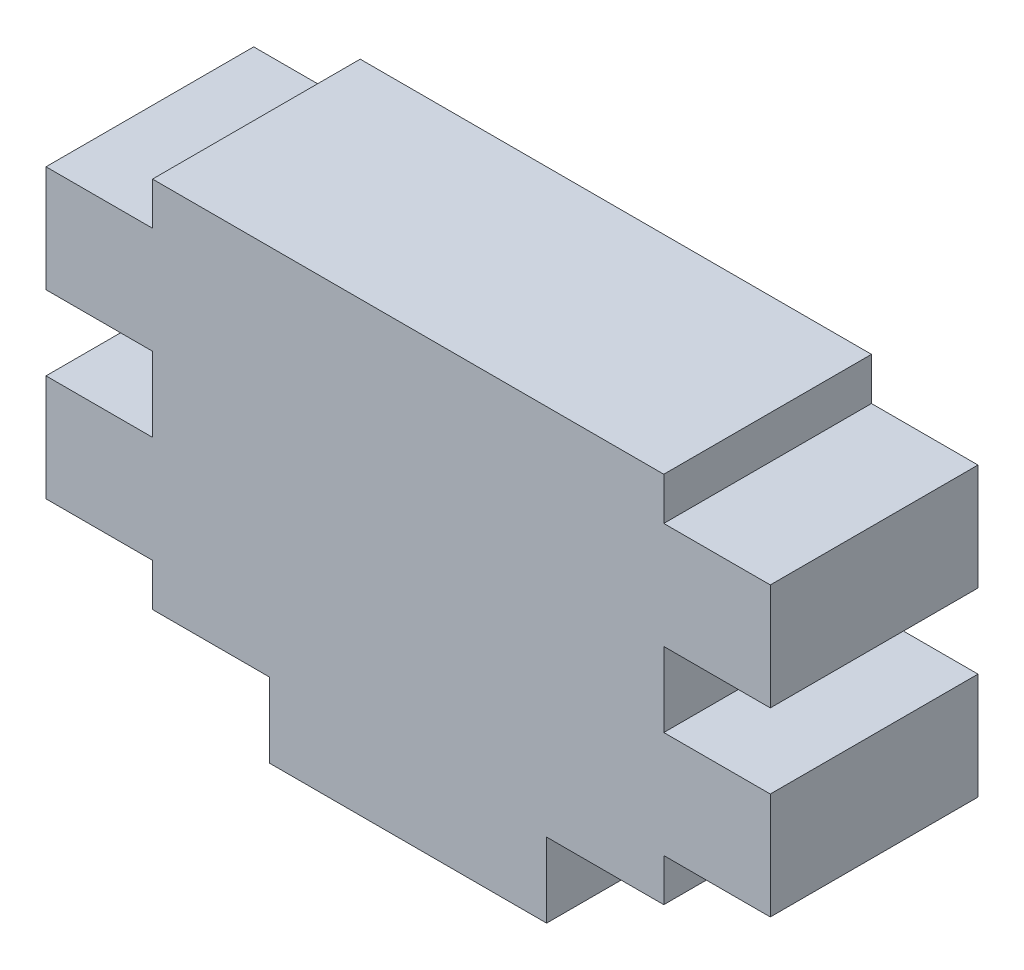
ISO-10303-21;
HEADER;
FILE_DESCRIPTION(('STEP AP214'),'2;1');
FILE_NAME('part.step','',(''),(''),'','','');
FILE_SCHEMA(('AUTOMOTIVE_DESIGN { 1 0 10303 214 1 1 1 1 }'));
ENDSEC;
DATA;
#1=APPLICATION_CONTEXT('core data for automotive mechanical design processes');
#2=APPLICATION_PROTOCOL_DEFINITION('international standard','automotive_design',2000,#1);
#3=PRODUCT_CONTEXT('',#1,'mechanical');
#4=PRODUCT('Part','Part','',(#3));
#5=PRODUCT_RELATED_PRODUCT_CATEGORY('part','',(#4));
#6=PRODUCT_DEFINITION_FORMATION('','',#4);
#7=PRODUCT_DEFINITION_CONTEXT('part definition',#1,'design');
#8=PRODUCT_DEFINITION('design','',#6,#7);
#9=PRODUCT_DEFINITION_SHAPE('','',#8);
#10=(LENGTH_UNIT() NAMED_UNIT(*) SI_UNIT(.MILLI.,.METRE.));
#11=(NAMED_UNIT(*) PLANE_ANGLE_UNIT() SI_UNIT($,.RADIAN.));
#12=(NAMED_UNIT(*) SI_UNIT($,.STERADIAN.) SOLID_ANGLE_UNIT());
#13=UNCERTAINTY_MEASURE_WITH_UNIT(LENGTH_MEASURE(1.E-05),#10,'distance_accuracy_value','');
#14=(GEOMETRIC_REPRESENTATION_CONTEXT(3) GLOBAL_UNCERTAINTY_ASSIGNED_CONTEXT((#13)) GLOBAL_UNIT_ASSIGNED_CONTEXT((#10,
#11,#12)) REPRESENTATION_CONTEXT('',''));
#15=CARTESIAN_POINT('',(0.,0.,0.));
#16=DIRECTION('',(0.,0.,1.));
#17=DIRECTION('',(1.,0.,0.));
#18=AXIS2_PLACEMENT_3D('',#15,#16,#17);
#19=CARTESIAN_POINT('',(3.399966,-0.350022,1.95));
#20=DIRECTION('',(-0.999999998847859,-4.80029281236349E-05,0.));
#21=DIRECTION('',(4.80029281236349E-05,-0.99999999884786,0.));
#22=AXIS2_PLACEMENT_3D('',#19,#20,#21);
#23=PLANE('',#22);
#24=DIRECTION('',(-4.80029281236349E-05,0.99999999884786,0.));
#25=VECTOR('',#24,1.);
#26=CARTESIAN_POINT('',(3.399966,-0.350022,0.));
#27=LINE('',#26,#25);
#28=CARTESIAN_POINT('',(3.400014,-1.349961,0.));
#29=VERTEX_POINT('',#28);
#30=CARTESIAN_POINT('',(3.399966,-0.350022,0.));
#31=VERTEX_POINT('',#30);
#32=EDGE_CURVE('E226',#29,#31,#27,.T.);
#33=ORIENTED_EDGE('',*,*,#32,.T.);
#34=DIRECTION('',(0.,0.,-1.));
#35=VECTOR('',#34,1.);
#36=CARTESIAN_POINT('',(3.399966,-0.350022,1.95));
#37=LINE('',#36,#35);
#38=CARTESIAN_POINT('',(3.399966,-0.350022,1.95));
#39=VERTEX_POINT('',#38);
#40=EDGE_CURVE('E11',#39,#31,#37,.T.);
#41=ORIENTED_EDGE('',*,*,#40,.F.);
#42=DIRECTION('',(-4.80029281236349E-05,0.99999999884786,0.));
#43=VECTOR('',#42,1.);
#44=CARTESIAN_POINT('',(3.399966,-0.350022,1.95));
#45=LINE('',#44,#43);
#46=CARTESIAN_POINT('',(3.400014,-1.349961,1.95));
#47=VERTEX_POINT('',#46);
#48=EDGE_CURVE('E272',#47,#39,#45,.T.);
#49=ORIENTED_EDGE('',*,*,#48,.F.);
#50=DIRECTION('',(0.,0.,-1.));
#51=VECTOR('',#50,1.);
#52=CARTESIAN_POINT('',(3.400014,-1.349961,1.95));
#53=LINE('',#52,#51);
#54=EDGE_CURVE('E222',#47,#29,#53,.T.);
#55=ORIENTED_EDGE('',*,*,#54,.T.);
#56=EDGE_LOOP('',(#33,#41,#49,#55));
#57=FACE_BOUND('',#56,.T.);
#58=ADVANCED_FACE('F34',(#57),#23,.F.);
#59=CARTESIAN_POINT('',(2.400034,-0.34997,1.95));
#60=DIRECTION('',(-5.20035361701516E-05,-0.999999998647816,0.));
#61=DIRECTION('',(0.999999998647816,-5.20035361701516E-05,0.));
#62=AXIS2_PLACEMENT_3D('',#59,#60,#61);
#63=PLANE('',#62);
#64=DIRECTION('',(-0.999999998647816,5.20035361701516E-05,0.));
#65=VECTOR('',#64,1.);
#66=CARTESIAN_POINT('',(2.400034,-0.34997,0.));
#67=LINE('',#66,#65);
#68=CARTESIAN_POINT('',(2.400034,-0.34997,0.));
#69=VERTEX_POINT('',#68);
#70=EDGE_CURVE('E229',#31,#69,#67,.T.);
#71=ORIENTED_EDGE('',*,*,#70,.T.);
#72=DIRECTION('',(0.,0.,-1.));
#73=VECTOR('',#72,1.);
#74=CARTESIAN_POINT('',(2.400034,-0.34997,1.95));
#75=LINE('',#74,#73);
#76=CARTESIAN_POINT('',(2.400034,-0.34997,1.95));
#77=VERTEX_POINT('',#76);
#78=EDGE_CURVE('E42',#77,#69,#75,.T.);
#79=ORIENTED_EDGE('',*,*,#78,.F.);
#80=DIRECTION('',(-0.999999998647816,5.20035361701516E-05,0.));
#81=VECTOR('',#80,1.);
#82=CARTESIAN_POINT('',(2.400034,-0.34997,1.95));
#83=LINE('',#82,#81);
#84=EDGE_CURVE('E141',#39,#77,#83,.T.);
#85=ORIENTED_EDGE('',*,*,#84,.F.);
#86=ORIENTED_EDGE('',*,*,#40,.T.);
#87=EDGE_LOOP('',(#71,#79,#85,#86));
#88=FACE_BOUND('',#87,.T.);
#89=ADVANCED_FACE('F410',(#88),#63,.F.);
#90=CARTESIAN_POINT('',(2.399964,0.35004,1.95));
#91=DIRECTION('',(-0.999999995000143,-9.99985709484068E-05,0.));
#92=DIRECTION('',(9.99985709484069E-05,-0.999999995000143,0.));
#93=AXIS2_PLACEMENT_3D('',#90,#91,#92);
#94=PLANE('',#93);
#95=DIRECTION('',(-9.99985709484068E-05,0.999999995000143,0.));
#96=VECTOR('',#95,1.);
#97=CARTESIAN_POINT('',(2.399964,0.35004,0.));
#98=LINE('',#97,#96);
#99=CARTESIAN_POINT('',(2.399964,0.35004,0.));
#100=VERTEX_POINT('',#99);
#101=EDGE_CURVE('E231',#69,#100,#98,.T.);
#102=ORIENTED_EDGE('',*,*,#101,.T.);
#103=DIRECTION('',(0.,0.,-1.));
#104=VECTOR('',#103,1.);
#105=CARTESIAN_POINT('',(2.399964,0.35004,1.95));
#106=LINE('',#105,#104);
#107=CARTESIAN_POINT('',(2.399964,0.35004,1.95));
#108=VERTEX_POINT('',#107);
#109=EDGE_CURVE('E327',#108,#100,#106,.T.);
#110=ORIENTED_EDGE('',*,*,#109,.F.);
#111=DIRECTION('',(-9.99985709484068E-05,0.999999995000143,0.));
#112=VECTOR('',#111,1.);
#113=CARTESIAN_POINT('',(2.399964,0.35004,1.95));
#114=LINE('',#113,#112);
#115=EDGE_CURVE('E335',#77,#108,#114,.T.);
#116=ORIENTED_EDGE('',*,*,#115,.F.);
#117=ORIENTED_EDGE('',*,*,#78,.T.);
#118=EDGE_LOOP('',(#102,#110,#116,#117));
#119=FACE_BOUND('',#118,.T.);
#120=ADVANCED_FACE('F333',(#119),#94,.F.);
#121=CARTESIAN_POINT('',(3.399996,0.349981,1.95));
#122=DIRECTION('',(5.8998111957796E-05,0.999999998259611,0.));
#123=DIRECTION('',(-0.999999998259611,5.8998111957796E-05,0.));
#124=AXIS2_PLACEMENT_3D('',#121,#122,#123);
#125=PLANE('',#124);
#126=DIRECTION('',(0.999999998259611,-5.8998111957796E-05,0.));
#127=VECTOR('',#126,1.);
#128=CARTESIAN_POINT('',(3.399996,0.349981,0.));
#129=LINE('',#128,#127);
#130=CARTESIAN_POINT('',(3.399996,0.349981,0.));
#131=VERTEX_POINT('',#130);
#132=EDGE_CURVE('E233',#100,#131,#129,.T.);
#133=ORIENTED_EDGE('',*,*,#132,.T.);
#134=DIRECTION('',(0.,0.,-1.));
#135=VECTOR('',#134,1.);
#136=CARTESIAN_POINT('',(3.399996,0.349981,1.95));
#137=LINE('',#136,#135);
#138=CARTESIAN_POINT('',(3.399996,0.349981,1.95));
#139=VERTEX_POINT('',#138);
#140=EDGE_CURVE('E324',#139,#131,#137,.T.);
#141=ORIENTED_EDGE('',*,*,#140,.F.);
#142=DIRECTION('',(0.999999998259611,-5.8998111957796E-05,0.));
#143=VECTOR('',#142,1.);
#144=CARTESIAN_POINT('',(3.399996,0.349981,1.95));
#145=LINE('',#144,#143);
#146=EDGE_CURVE('E353',#108,#139,#145,.T.);
#147=ORIENTED_EDGE('',*,*,#146,.F.);
#148=ORIENTED_EDGE('',*,*,#109,.T.);
#149=EDGE_LOOP('',(#133,#141,#147,#148));
#150=FACE_BOUND('',#149,.T.);
#151=ADVANCED_FACE('F344',(#150),#125,.F.);
#152=CARTESIAN_POINT('',(3.399955,1.35002,1.95));
#153=DIRECTION('',(-0.999999999159566,-4.09984010280056E-05,0.));
#154=DIRECTION('',(4.09984010280056E-05,-0.999999999159566,0.));
#155=AXIS2_PLACEMENT_3D('',#152,#153,#154);
#156=PLANE('',#155);
#157=DIRECTION('',(-4.09984010280056E-05,0.999999999159566,0.));
#158=VECTOR('',#157,1.);
#159=CARTESIAN_POINT('',(3.399955,1.35002,0.));
#160=LINE('',#159,#158);
#161=CARTESIAN_POINT('',(3.399955,1.35002,0.));
#162=VERTEX_POINT('',#161);
#163=EDGE_CURVE('E235',#131,#162,#160,.T.);
#164=ORIENTED_EDGE('',*,*,#163,.T.);
#165=DIRECTION('',(0.,0.,-1.));
#166=VECTOR('',#165,1.);
#167=CARTESIAN_POINT('',(3.399955,1.35002,1.95));
#168=LINE('',#167,#166);
#169=CARTESIAN_POINT('',(3.399955,1.35002,1.95));
#170=VERTEX_POINT('',#169);
#171=EDGE_CURVE('E321',#170,#162,#168,.T.);
#172=ORIENTED_EDGE('',*,*,#171,.F.);
#173=DIRECTION('',(-4.09984010280056E-05,0.999999999159566,0.));
#174=VECTOR('',#173,1.);
#175=CARTESIAN_POINT('',(3.399955,1.35002,1.95));
#176=LINE('',#175,#174);
#177=EDGE_CURVE('E350',#139,#170,#176,.T.);
#178=ORIENTED_EDGE('',*,*,#177,.F.);
#179=ORIENTED_EDGE('',*,*,#140,.T.);
#180=EDGE_LOOP('',(#164,#172,#178,#179));
#181=FACE_BOUND('',#180,.T.);
#182=ADVANCED_FACE('F348',(#181),#156,.F.);
#183=CARTESIAN_POINT('',(2.400016,1.349972,1.95));
#184=DIRECTION('',(4.80029281234181E-05,-0.999999998847859,0.));
#185=DIRECTION('',(0.99999999884786,4.80029281234181E-05,0.));
#186=AXIS2_PLACEMENT_3D('',#183,#184,#185);
#187=PLANE('',#186);
#188=DIRECTION('',(-0.99999999884786,-4.80029281234181E-05,0.));
#189=VECTOR('',#188,1.);
#190=CARTESIAN_POINT('',(2.400016,1.349972,0.));
#191=LINE('',#190,#189);
#192=CARTESIAN_POINT('',(2.400016,1.349972,0.));
#193=VERTEX_POINT('',#192);
#194=EDGE_CURVE('E237',#162,#193,#191,.T.);
#195=ORIENTED_EDGE('',*,*,#194,.T.);
#196=DIRECTION('',(0.,0.,-1.));
#197=VECTOR('',#196,1.);
#198=CARTESIAN_POINT('',(2.400016,1.349972,1.95));
#199=LINE('',#198,#197);
#200=CARTESIAN_POINT('',(2.400016,1.349972,1.95));
#201=VERTEX_POINT('',#200);
#202=EDGE_CURVE('E318',#201,#193,#199,.T.);
#203=ORIENTED_EDGE('',*,*,#202,.F.);
#204=DIRECTION('',(-0.99999999884786,-4.80029281234181E-05,0.));
#205=VECTOR('',#204,1.);
#206=CARTESIAN_POINT('',(2.400016,1.349972,1.95));
#207=LINE('',#206,#205);
#208=EDGE_CURVE('E352',#170,#201,#207,.T.);
#209=ORIENTED_EDGE('',*,*,#208,.F.);
#210=ORIENTED_EDGE('',*,*,#171,.T.);
#211=EDGE_LOOP('',(#195,#203,#209,#210));
#212=FACE_BOUND('',#211,.T.);
#213=ADVANCED_FACE('F423',(#212),#187,.F.);
#214=CARTESIAN_POINT('',(2.400023,1.750046,1.95));
#215=DIRECTION('',(-0.999999999846932,1.7496763095611E-05,0.));
#216=DIRECTION('',(-1.7496763095611E-05,-0.999999999846932,0.));
#217=AXIS2_PLACEMENT_3D('',#214,#215,#216);
#218=PLANE('',#217);
#219=DIRECTION('',(1.7496763095611E-05,0.999999999846932,0.));
#220=VECTOR('',#219,1.);
#221=CARTESIAN_POINT('',(2.400023,1.750046,0.));
#222=LINE('',#221,#220);
#223=CARTESIAN_POINT('',(2.400023,1.750046,0.));
#224=VERTEX_POINT('',#223);
#225=EDGE_CURVE('E239',#193,#224,#222,.T.);
#226=ORIENTED_EDGE('',*,*,#225,.T.);
#227=DIRECTION('',(0.,0.,-1.));
#228=VECTOR('',#227,1.);
#229=CARTESIAN_POINT('',(2.400023,1.750046,1.95));
#230=LINE('',#229,#228);
#231=CARTESIAN_POINT('',(2.400023,1.750046,1.95));
#232=VERTEX_POINT('',#231);
#233=EDGE_CURVE('E315',#232,#224,#230,.T.);
#234=ORIENTED_EDGE('',*,*,#233,.F.);
#235=DIRECTION('',(1.7496763095611E-05,0.999999999846932,0.));
#236=VECTOR('',#235,1.);
#237=CARTESIAN_POINT('',(2.400023,1.750046,1.95));
#238=LINE('',#237,#236);
#239=EDGE_CURVE('E355',#201,#232,#238,.T.);
#240=ORIENTED_EDGE('',*,*,#239,.F.);
#241=ORIENTED_EDGE('',*,*,#202,.T.);
#242=EDGE_LOOP('',(#226,#234,#240,#241));
#243=FACE_BOUND('',#242,.T.);
#244=ADVANCED_FACE('F426',(#243),#218,.F.);
#245=CARTESIAN_POINT('',(-2.399974,1.749977,1.95));
#246=DIRECTION('',(1.43750089828733E-05,-0.99999999989668,0.));
#247=DIRECTION('',(0.99999999989668,1.43750089828733E-05,0.));
#248=AXIS2_PLACEMENT_3D('',#245,#246,#247);
#249=PLANE('',#248);
#250=DIRECTION('',(-0.99999999989668,-1.43750089828733E-05,0.));
#251=VECTOR('',#250,1.);
#252=CARTESIAN_POINT('',(-2.399974,1.749977,0.));
#253=LINE('',#252,#251);
#254=CARTESIAN_POINT('',(-2.399974,1.749977,0.));
#255=VERTEX_POINT('',#254);
#256=EDGE_CURVE('E241',#224,#255,#253,.T.);
#257=ORIENTED_EDGE('',*,*,#256,.T.);
#258=DIRECTION('',(0.,0.,-1.));
#259=VECTOR('',#258,1.);
#260=CARTESIAN_POINT('',(-2.399974,1.749977,1.95));
#261=LINE('',#260,#259);
#262=CARTESIAN_POINT('',(-2.399974,1.749977,1.95));
#263=VERTEX_POINT('',#262);
#264=EDGE_CURVE('E312',#263,#255,#261,.T.);
#265=ORIENTED_EDGE('',*,*,#264,.F.);
#266=DIRECTION('',(-0.99999999989668,-1.43750089828733E-05,0.));
#267=VECTOR('',#266,1.);
#268=CARTESIAN_POINT('',(-2.399974,1.749977,1.95));
#269=LINE('',#268,#267);
#270=EDGE_CURVE('E361',#232,#263,#269,.T.);
#271=ORIENTED_EDGE('',*,*,#270,.F.);
#272=ORIENTED_EDGE('',*,*,#233,.T.);
#273=EDGE_LOOP('',(#257,#265,#271,#272));
#274=FACE_BOUND('',#273,.T.);
#275=ADVANCED_FACE('F430',(#274),#249,.F.);
#276=CARTESIAN_POINT('',(-2.399975,1.350002,1.95));
#277=DIRECTION('',(0.999999999996875,-2.50015625952672E-06,0.));
#278=DIRECTION('',(2.50015625952672E-06,0.999999999996875,0.));
#279=AXIS2_PLACEMENT_3D('',#276,#277,#278);
#280=PLANE('',#279);
#281=DIRECTION('',(-2.50015625952672E-06,-0.999999999996875,0.));
#282=VECTOR('',#281,1.);
#283=CARTESIAN_POINT('',(-2.399975,1.350002,0.));
#284=LINE('',#283,#282);
#285=CARTESIAN_POINT('',(-2.399975,1.350002,0.));
#286=VERTEX_POINT('',#285);
#287=EDGE_CURVE('E243',#255,#286,#284,.T.);
#288=ORIENTED_EDGE('',*,*,#287,.T.);
#289=DIRECTION('',(0.,0.,-1.));
#290=VECTOR('',#289,1.);
#291=CARTESIAN_POINT('',(-2.399975,1.350002,1.95));
#292=LINE('',#291,#290);
#293=CARTESIAN_POINT('',(-2.399975,1.350002,1.95));
#294=VERTEX_POINT('',#293);
#295=EDGE_CURVE('E309',#294,#286,#292,.T.);
#296=ORIENTED_EDGE('',*,*,#295,.F.);
#297=DIRECTION('',(-2.50015625952672E-06,-0.999999999996875,0.));
#298=VECTOR('',#297,1.);
#299=CARTESIAN_POINT('',(-2.399975,1.350002,1.95));
#300=LINE('',#299,#298);
#301=EDGE_CURVE('E363',#263,#294,#300,.T.);
#302=ORIENTED_EDGE('',*,*,#301,.F.);
#303=ORIENTED_EDGE('',*,*,#264,.T.);
#304=EDGE_LOOP('',(#288,#296,#302,#303));
#305=FACE_BOUND('',#304,.T.);
#306=ADVANCED_FACE('F434',(#305),#280,.F.);
#307=CARTESIAN_POINT('',(-3.400014,1.349961,1.95));
#308=DIRECTION('',(4.09984010277887E-05,-0.999999999159566,0.));
#309=DIRECTION('',(0.999999999159566,4.09984010277887E-05,0.));
#310=AXIS2_PLACEMENT_3D('',#307,#308,#309);
#311=PLANE('',#310);
#312=DIRECTION('',(-0.999999999159566,-4.09984010277887E-05,0.));
#313=VECTOR('',#312,1.);
#314=CARTESIAN_POINT('',(-3.400014,1.349961,0.));
#315=LINE('',#314,#313);
#316=CARTESIAN_POINT('',(-3.400014,1.349961,0.));
#317=VERTEX_POINT('',#316);
#318=EDGE_CURVE('E245',#286,#317,#315,.T.);
#319=ORIENTED_EDGE('',*,*,#318,.T.);
#320=DIRECTION('',(0.,0.,-1.));
#321=VECTOR('',#320,1.);
#322=CARTESIAN_POINT('',(-3.400014,1.349961,1.95));
#323=LINE('',#322,#321);
#324=CARTESIAN_POINT('',(-3.400014,1.349961,1.95));
#325=VERTEX_POINT('',#324);
#326=EDGE_CURVE('E306',#325,#317,#323,.T.);
#327=ORIENTED_EDGE('',*,*,#326,.F.);
#328=DIRECTION('',(-0.999999999159566,-4.09984010277887E-05,0.));
#329=VECTOR('',#328,1.);
#330=CARTESIAN_POINT('',(-3.400014,1.349961,1.95));
#331=LINE('',#330,#329);
#332=EDGE_CURVE('E365',#294,#325,#331,.T.);
#333=ORIENTED_EDGE('',*,*,#332,.F.);
#334=ORIENTED_EDGE('',*,*,#295,.T.);
#335=EDGE_LOOP('',(#319,#327,#333,#334));
#336=FACE_BOUND('',#335,.T.);
#337=ADVANCED_FACE('F438',(#336),#311,.F.);
#338=CARTESIAN_POINT('',(-3.399966,0.350022,1.95));
#339=DIRECTION('',(0.999999998847859,4.80029281236349E-05,0.));
#340=DIRECTION('',(-4.80029281236349E-05,0.99999999884786,0.));
#341=AXIS2_PLACEMENT_3D('',#338,#339,#340);
#342=PLANE('',#341);
#343=DIRECTION('',(4.80029281236349E-05,-0.99999999884786,0.));
#344=VECTOR('',#343,1.);
#345=CARTESIAN_POINT('',(-3.399966,0.350022,0.));
#346=LINE('',#345,#344);
#347=CARTESIAN_POINT('',(-3.399966,0.350022,0.));
#348=VERTEX_POINT('',#347);
#349=EDGE_CURVE('E247',#317,#348,#346,.T.);
#350=ORIENTED_EDGE('',*,*,#349,.T.);
#351=DIRECTION('',(0.,0.,-1.));
#352=VECTOR('',#351,1.);
#353=CARTESIAN_POINT('',(-3.399966,0.350022,1.95));
#354=LINE('',#353,#352);
#355=CARTESIAN_POINT('',(-3.399966,0.350022,1.95));
#356=VERTEX_POINT('',#355);
#357=EDGE_CURVE('E303',#356,#348,#354,.T.);
#358=ORIENTED_EDGE('',*,*,#357,.F.);
#359=DIRECTION('',(4.80029281236349E-05,-0.99999999884786,0.));
#360=VECTOR('',#359,1.);
#361=CARTESIAN_POINT('',(-3.399966,0.350022,1.95));
#362=LINE('',#361,#360);
#363=EDGE_CURVE('E367',#325,#356,#362,.T.);
#364=ORIENTED_EDGE('',*,*,#363,.F.);
#365=ORIENTED_EDGE('',*,*,#326,.T.);
#366=EDGE_LOOP('',(#350,#358,#364,#365));
#367=FACE_BOUND('',#366,.T.);
#368=ADVANCED_FACE('F442',(#367),#342,.F.);
#369=CARTESIAN_POINT('',(-2.400034,0.34997,1.95));
#370=DIRECTION('',(5.20035361701516E-05,0.999999998647816,0.));
#371=DIRECTION('',(-0.999999998647816,5.20035361701516E-05,0.));
#372=AXIS2_PLACEMENT_3D('',#369,#370,#371);
#373=PLANE('',#372);
#374=DIRECTION('',(0.999999998647816,-5.20035361701516E-05,0.));
#375=VECTOR('',#374,1.);
#376=CARTESIAN_POINT('',(-2.400034,0.34997,0.));
#377=LINE('',#376,#375);
#378=CARTESIAN_POINT('',(-2.400034,0.34997,0.));
#379=VERTEX_POINT('',#378);
#380=EDGE_CURVE('E249',#348,#379,#377,.T.);
#381=ORIENTED_EDGE('',*,*,#380,.T.);
#382=DIRECTION('',(0.,0.,-1.));
#383=VECTOR('',#382,1.);
#384=CARTESIAN_POINT('',(-2.400034,0.34997,1.95));
#385=LINE('',#384,#383);
#386=CARTESIAN_POINT('',(-2.400034,0.34997,1.95));
#387=VERTEX_POINT('',#386);
#388=EDGE_CURVE('E300',#387,#379,#385,.T.);
#389=ORIENTED_EDGE('',*,*,#388,.F.);
#390=DIRECTION('',(0.999999998647816,-5.20035361701516E-05,0.));
#391=VECTOR('',#390,1.);
#392=CARTESIAN_POINT('',(-2.400034,0.34997,1.95));
#393=LINE('',#392,#391);
#394=EDGE_CURVE('E369',#356,#387,#393,.T.);
#395=ORIENTED_EDGE('',*,*,#394,.F.);
#396=ORIENTED_EDGE('',*,*,#357,.T.);
#397=EDGE_LOOP('',(#381,#389,#395,#396));
#398=FACE_BOUND('',#397,.T.);
#399=ADVANCED_FACE('F446',(#398),#373,.F.);
#400=CARTESIAN_POINT('',(-2.399964,-0.35004,1.95));
#401=DIRECTION('',(0.999999995000143,9.99985709484068E-05,0.));
#402=DIRECTION('',(-9.99985709484069E-05,0.999999995000143,0.));
#403=AXIS2_PLACEMENT_3D('',#400,#401,#402);
#404=PLANE('',#403);
#405=DIRECTION('',(9.99985709484068E-05,-0.999999995000143,0.));
#406=VECTOR('',#405,1.);
#407=CARTESIAN_POINT('',(-2.399964,-0.35004,0.));
#408=LINE('',#407,#406);
#409=CARTESIAN_POINT('',(-2.399964,-0.35004,0.));
#410=VERTEX_POINT('',#409);
#411=EDGE_CURVE('E251',#379,#410,#408,.T.);
#412=ORIENTED_EDGE('',*,*,#411,.T.);
#413=DIRECTION('',(0.,0.,-1.));
#414=VECTOR('',#413,1.);
#415=CARTESIAN_POINT('',(-2.399964,-0.35004,1.95));
#416=LINE('',#415,#414);
#417=CARTESIAN_POINT('',(-2.399964,-0.35004,1.95));
#418=VERTEX_POINT('',#417);
#419=EDGE_CURVE('E297',#418,#410,#416,.T.);
#420=ORIENTED_EDGE('',*,*,#419,.F.);
#421=DIRECTION('',(9.99985709484068E-05,-0.999999995000143,0.));
#422=VECTOR('',#421,1.);
#423=CARTESIAN_POINT('',(-2.399964,-0.35004,1.95));
#424=LINE('',#423,#422);
#425=EDGE_CURVE('E371',#387,#418,#424,.T.);
#426=ORIENTED_EDGE('',*,*,#425,.F.);
#427=ORIENTED_EDGE('',*,*,#388,.T.);
#428=EDGE_LOOP('',(#412,#420,#426,#427));
#429=FACE_BOUND('',#428,.T.);
#430=ADVANCED_FACE('F450',(#429),#404,.F.);
#431=CARTESIAN_POINT('',(-3.399996,-0.349981,1.95));
#432=DIRECTION('',(-5.8998111957796E-05,-0.999999998259611,0.));
#433=DIRECTION('',(0.999999998259611,-5.8998111957796E-05,0.));
#434=AXIS2_PLACEMENT_3D('',#431,#432,#433);
#435=PLANE('',#434);
#436=DIRECTION('',(-0.999999998259611,5.8998111957796E-05,0.));
#437=VECTOR('',#436,1.);
#438=CARTESIAN_POINT('',(-3.399996,-0.349981,0.));
#439=LINE('',#438,#437);
#440=CARTESIAN_POINT('',(-3.399996,-0.349981,0.));
#441=VERTEX_POINT('',#440);
#442=EDGE_CURVE('E253',#410,#441,#439,.T.);
#443=ORIENTED_EDGE('',*,*,#442,.T.);
#444=DIRECTION('',(0.,0.,-1.));
#445=VECTOR('',#444,1.);
#446=CARTESIAN_POINT('',(-3.399996,-0.349981,1.95));
#447=LINE('',#446,#445);
#448=CARTESIAN_POINT('',(-3.399996,-0.349981,1.95));
#449=VERTEX_POINT('',#448);
#450=EDGE_CURVE('E294',#449,#441,#447,.T.);
#451=ORIENTED_EDGE('',*,*,#450,.F.);
#452=DIRECTION('',(-0.999999998259611,5.8998111957796E-05,0.));
#453=VECTOR('',#452,1.);
#454=CARTESIAN_POINT('',(-3.399996,-0.349981,1.95));
#455=LINE('',#454,#453);
#456=EDGE_CURVE('E373',#418,#449,#455,.T.);
#457=ORIENTED_EDGE('',*,*,#456,.F.);
#458=ORIENTED_EDGE('',*,*,#419,.T.);
#459=EDGE_LOOP('',(#443,#451,#457,#458));
#460=FACE_BOUND('',#459,.T.);
#461=ADVANCED_FACE('F454',(#460),#435,.F.);
#462=CARTESIAN_POINT('',(-3.399955,-1.35002,1.95));
#463=DIRECTION('',(0.999999999159566,4.09984010280056E-05,0.));
#464=DIRECTION('',(-4.09984010280056E-05,0.999999999159566,0.));
#465=AXIS2_PLACEMENT_3D('',#462,#463,#464);
#466=PLANE('',#465);
#467=DIRECTION('',(4.09984010280056E-05,-0.999999999159566,0.));
#468=VECTOR('',#467,1.);
#469=CARTESIAN_POINT('',(-3.399955,-1.35002,0.));
#470=LINE('',#469,#468);
#471=CARTESIAN_POINT('',(-3.399955,-1.35002,0.));
#472=VERTEX_POINT('',#471);
#473=EDGE_CURVE('E255',#441,#472,#470,.T.);
#474=ORIENTED_EDGE('',*,*,#473,.T.);
#475=DIRECTION('',(0.,0.,-1.));
#476=VECTOR('',#475,1.);
#477=CARTESIAN_POINT('',(-3.399955,-1.35002,1.95));
#478=LINE('',#477,#476);
#479=CARTESIAN_POINT('',(-3.399955,-1.35002,1.95));
#480=VERTEX_POINT('',#479);
#481=EDGE_CURVE('E291',#480,#472,#478,.T.);
#482=ORIENTED_EDGE('',*,*,#481,.F.);
#483=DIRECTION('',(4.09984010280056E-05,-0.999999999159566,0.));
#484=VECTOR('',#483,1.);
#485=CARTESIAN_POINT('',(-3.399955,-1.35002,1.95));
#486=LINE('',#485,#484);
#487=EDGE_CURVE('E375',#449,#480,#486,.T.);
#488=ORIENTED_EDGE('',*,*,#487,.F.);
#489=ORIENTED_EDGE('',*,*,#450,.T.);
#490=EDGE_LOOP('',(#474,#482,#488,#489));
#491=FACE_BOUND('',#490,.T.);
#492=ADVANCED_FACE('F458',(#491),#466,.F.);
#493=CARTESIAN_POINT('',(-2.400016,-1.349972,1.95));
#494=DIRECTION('',(-4.80029281234181E-05,0.999999998847859,0.));
#495=DIRECTION('',(-0.99999999884786,-4.80029281234181E-05,0.));
#496=AXIS2_PLACEMENT_3D('',#493,#494,#495);
#497=PLANE('',#496);
#498=DIRECTION('',(0.99999999884786,4.80029281234181E-05,0.));
#499=VECTOR('',#498,1.);
#500=CARTESIAN_POINT('',(-2.400016,-1.349972,0.));
#501=LINE('',#500,#499);
#502=CARTESIAN_POINT('',(-2.400016,-1.349972,0.));
#503=VERTEX_POINT('',#502);
#504=EDGE_CURVE('E257',#472,#503,#501,.T.);
#505=ORIENTED_EDGE('',*,*,#504,.T.);
#506=DIRECTION('',(0.,0.,-1.));
#507=VECTOR('',#506,1.);
#508=CARTESIAN_POINT('',(-2.400016,-1.349972,1.95));
#509=LINE('',#508,#507);
#510=CARTESIAN_POINT('',(-2.400016,-1.349972,1.95));
#511=VERTEX_POINT('',#510);
#512=EDGE_CURVE('E288',#511,#503,#509,.T.);
#513=ORIENTED_EDGE('',*,*,#512,.F.);
#514=DIRECTION('',(0.99999999884786,4.80029281234181E-05,0.));
#515=VECTOR('',#514,1.);
#516=CARTESIAN_POINT('',(-2.400016,-1.349972,1.95));
#517=LINE('',#516,#515);
#518=EDGE_CURVE('E377',#480,#511,#517,.T.);
#519=ORIENTED_EDGE('',*,*,#518,.F.);
#520=ORIENTED_EDGE('',*,*,#481,.T.);
#521=EDGE_LOOP('',(#505,#513,#519,#520));
#522=FACE_BOUND('',#521,.T.);
#523=ADVANCED_FACE('F462',(#522),#497,.F.);
#524=CARTESIAN_POINT('',(-2.400023,-1.750046,1.95));
#525=DIRECTION('',(0.999999999846932,-1.7496763095611E-05,0.));
#526=DIRECTION('',(1.7496763095611E-05,0.999999999846932,0.));
#527=AXIS2_PLACEMENT_3D('',#524,#525,#526);
#528=PLANE('',#527);
#529=DIRECTION('',(-1.7496763095611E-05,-0.999999999846932,0.));
#530=VECTOR('',#529,1.);
#531=CARTESIAN_POINT('',(-2.400023,-1.750046,0.));
#532=LINE('',#531,#530);
#533=CARTESIAN_POINT('',(-2.400023,-1.750046,0.));
#534=VERTEX_POINT('',#533);
#535=EDGE_CURVE('E259',#503,#534,#532,.T.);
#536=ORIENTED_EDGE('',*,*,#535,.T.);
#537=DIRECTION('',(0.,0.,-1.));
#538=VECTOR('',#537,1.);
#539=CARTESIAN_POINT('',(-2.400023,-1.750046,1.95));
#540=LINE('',#539,#538);
#541=CARTESIAN_POINT('',(-2.400023,-1.750046,1.95));
#542=VERTEX_POINT('',#541);
#543=EDGE_CURVE('E285',#542,#534,#540,.T.);
#544=ORIENTED_EDGE('',*,*,#543,.F.);
#545=DIRECTION('',(-1.7496763095611E-05,-0.999999999846932,0.));
#546=VECTOR('',#545,1.);
#547=CARTESIAN_POINT('',(-2.400023,-1.750046,1.95));
#548=LINE('',#547,#546);
#549=EDGE_CURVE('E379',#511,#542,#548,.T.);
#550=ORIENTED_EDGE('',*,*,#549,.F.);
#551=ORIENTED_EDGE('',*,*,#512,.T.);
#552=EDGE_LOOP('',(#536,#544,#550,#551));
#553=FACE_BOUND('',#552,.T.);
#554=ADVANCED_FACE('F466',(#553),#528,.F.);
#555=CARTESIAN_POINT('',(-1.300039,-1.749977,1.95));
#556=DIRECTION('',(-6.27281850137296E-05,0.999999998032587,0.));
#557=DIRECTION('',(-0.999999998032588,-6.27281850137296E-05,0.));
#558=AXIS2_PLACEMENT_3D('',#555,#556,#557);
#559=PLANE('',#558);
#560=DIRECTION('',(0.999999998032587,6.27281850137296E-05,0.));
#561=VECTOR('',#560,1.);
#562=CARTESIAN_POINT('',(-1.300039,-1.749977,0.));
#563=LINE('',#562,#561);
#564=CARTESIAN_POINT('',(-1.300039,-1.749977,0.));
#565=VERTEX_POINT('',#564);
#566=EDGE_CURVE('E261',#534,#565,#563,.T.);
#567=ORIENTED_EDGE('',*,*,#566,.T.);
#568=DIRECTION('',(0.,0.,-1.));
#569=VECTOR('',#568,1.);
#570=CARTESIAN_POINT('',(-1.300039,-1.749977,1.95));
#571=LINE('',#570,#569);
#572=CARTESIAN_POINT('',(-1.300039,-1.749977,1.95));
#573=VERTEX_POINT('',#572);
#574=EDGE_CURVE('E282',#573,#565,#571,.T.);
#575=ORIENTED_EDGE('',*,*,#574,.F.);
#576=DIRECTION('',(0.999999998032587,6.27281850137296E-05,0.));
#577=VECTOR('',#576,1.);
#578=CARTESIAN_POINT('',(-1.300039,-1.749977,1.95));
#579=LINE('',#578,#577);
#580=EDGE_CURVE('E381',#542,#573,#579,.T.);
#581=ORIENTED_EDGE('',*,*,#580,.F.);
#582=ORIENTED_EDGE('',*,*,#543,.T.);
#583=EDGE_LOOP('',(#567,#575,#581,#582));
#584=FACE_BOUND('',#583,.T.);
#585=ADVANCED_FACE('F470',(#584),#559,.F.);
#586=CARTESIAN_POINT('',(-1.299969,-2.449987,1.95));
#587=DIRECTION('',(0.999999995000143,9.99985709490264E-05,0.));
#588=DIRECTION('',(-9.99985709490264E-05,0.999999995000143,0.));
#589=AXIS2_PLACEMENT_3D('',#586,#587,#588);
#590=PLANE('',#589);
#591=DIRECTION('',(9.99985709490264E-05,-0.999999995000143,0.));
#592=VECTOR('',#591,1.);
#593=CARTESIAN_POINT('',(-1.299969,-2.449987,0.));
#594=LINE('',#593,#592);
#595=CARTESIAN_POINT('',(-1.299969,-2.449987,0.));
#596=VERTEX_POINT('',#595);
#597=EDGE_CURVE('E263',#565,#596,#594,.T.);
#598=ORIENTED_EDGE('',*,*,#597,.T.);
#599=DIRECTION('',(0.,0.,-1.));
#600=VECTOR('',#599,1.);
#601=CARTESIAN_POINT('',(-1.299969,-2.449987,1.95));
#602=LINE('',#601,#600);
#603=CARTESIAN_POINT('',(-1.299969,-2.449987,1.95));
#604=VERTEX_POINT('',#603);
#605=EDGE_CURVE('E279',#604,#596,#602,.T.);
#606=ORIENTED_EDGE('',*,*,#605,.F.);
#607=DIRECTION('',(9.99985709490264E-05,-0.999999995000143,0.));
#608=VECTOR('',#607,1.);
#609=CARTESIAN_POINT('',(-1.299969,-2.449987,1.95));
#610=LINE('',#609,#608);
#611=EDGE_CURVE('E383',#573,#604,#610,.T.);
#612=ORIENTED_EDGE('',*,*,#611,.F.);
#613=ORIENTED_EDGE('',*,*,#574,.T.);
#614=EDGE_LOOP('',(#598,#606,#612,#613));
#615=FACE_BOUND('',#614,.T.);
#616=ADVANCED_FACE('F474',(#615),#590,.F.);
#617=CARTESIAN_POINT('',(1.299967,-2.449949,1.95));
#618=DIRECTION('',(-1.4615744385973E-05,0.99999999989319,0.));
#619=DIRECTION('',(-0.99999999989319,-1.4615744385973E-05,0.));
#620=AXIS2_PLACEMENT_3D('',#617,#618,#619);
#621=PLANE('',#620);
#622=DIRECTION('',(0.99999999989319,1.4615744385973E-05,0.));
#623=VECTOR('',#622,1.);
#624=CARTESIAN_POINT('',(1.299967,-2.449949,0.));
#625=LINE('',#624,#623);
#626=CARTESIAN_POINT('',(1.299967,-2.449949,0.));
#627=VERTEX_POINT('',#626);
#628=EDGE_CURVE('E265',#596,#627,#625,.T.);
#629=ORIENTED_EDGE('',*,*,#628,.T.);
#630=DIRECTION('',(0.,0.,-1.));
#631=VECTOR('',#630,1.);
#632=CARTESIAN_POINT('',(1.299967,-2.449949,1.95));
#633=LINE('',#632,#631);
#634=CARTESIAN_POINT('',(1.299967,-2.449949,1.95));
#635=VERTEX_POINT('',#634);
#636=EDGE_CURVE('E276',#635,#627,#633,.T.);
#637=ORIENTED_EDGE('',*,*,#636,.F.);
#638=DIRECTION('',(0.99999999989319,1.4615744385973E-05,0.));
#639=VECTOR('',#638,1.);
#640=CARTESIAN_POINT('',(1.299967,-2.449949,1.95));
#641=LINE('',#640,#639);
#642=EDGE_CURVE('E385',#604,#635,#641,.T.);
#643=ORIENTED_EDGE('',*,*,#642,.F.);
#644=ORIENTED_EDGE('',*,*,#605,.T.);
#645=EDGE_LOOP('',(#629,#637,#643,#644));
#646=FACE_BOUND('',#645,.T.);
#647=ADVANCED_FACE('F391',(#646),#621,.F.);
#648=CARTESIAN_POINT('',(1.29999,-1.750046,1.95));
#649=DIRECTION('',(-0.999999999460055,3.28616965313783E-05,0.));
#650=DIRECTION('',(-3.28616965313783E-05,-0.999999999460055,0.));
#651=AXIS2_PLACEMENT_3D('',#648,#649,#650);
#652=PLANE('',#651);
#653=DIRECTION('',(3.28616965313783E-05,0.999999999460054,0.));
#654=VECTOR('',#653,1.);
#655=CARTESIAN_POINT('',(1.29999,-1.750046,0.));
#656=LINE('',#655,#654);
#657=CARTESIAN_POINT('',(1.29999,-1.750046,0.));
#658=VERTEX_POINT('',#657);
#659=EDGE_CURVE('E267',#627,#658,#656,.T.);
#660=ORIENTED_EDGE('',*,*,#659,.T.);
#661=DIRECTION('',(0.,0.,-1.));
#662=VECTOR('',#661,1.);
#663=CARTESIAN_POINT('',(1.29999,-1.750046,1.95));
#664=LINE('',#663,#662);
#665=CARTESIAN_POINT('',(1.29999,-1.750046,1.95));
#666=VERTEX_POINT('',#665);
#667=EDGE_CURVE('E217',#666,#658,#664,.T.);
#668=ORIENTED_EDGE('',*,*,#667,.F.);
#669=DIRECTION('',(3.28616965313783E-05,0.999999999460054,0.));
#670=VECTOR('',#669,1.);
#671=CARTESIAN_POINT('',(1.29999,-1.750046,1.95));
#672=LINE('',#671,#670);
#673=EDGE_CURVE('E208',#635,#666,#672,.T.);
#674=ORIENTED_EDGE('',*,*,#673,.F.);
#675=ORIENTED_EDGE('',*,*,#636,.T.);
#676=EDGE_LOOP('',(#660,#668,#674,#675));
#677=FACE_BOUND('',#676,.T.);
#678=ADVANCED_FACE('F395',(#677),#652,.F.);
#679=CARTESIAN_POINT('',(2.399974,-1.749977,1.95));
#680=DIRECTION('',(-6.27281850137296E-05,0.999999998032587,0.));
#681=DIRECTION('',(-0.999999998032587,-6.27281850137296E-05,0.));
#682=AXIS2_PLACEMENT_3D('',#679,#680,#681);
#683=PLANE('',#682);
#684=DIRECTION('',(0.999999998032587,6.27281850137296E-05,0.));
#685=VECTOR('',#684,1.);
#686=CARTESIAN_POINT('',(2.399974,-1.749977,0.));
#687=LINE('',#686,#685);
#688=CARTESIAN_POINT('',(2.399974,-1.749977,0.));
#689=VERTEX_POINT('',#688);
#690=EDGE_CURVE('E216',#658,#689,#687,.T.);
#691=ORIENTED_EDGE('',*,*,#690,.T.);
#692=DIRECTION('',(0.,0.,-1.));
#693=VECTOR('',#692,1.);
#694=CARTESIAN_POINT('',(2.399974,-1.749977,1.95));
#695=LINE('',#694,#693);
#696=CARTESIAN_POINT('',(2.399974,-1.749977,1.95));
#697=VERTEX_POINT('',#696);
#698=EDGE_CURVE('E213',#697,#689,#695,.T.);
#699=ORIENTED_EDGE('',*,*,#698,.F.);
#700=DIRECTION('',(0.999999998032587,6.27281850137296E-05,0.));
#701=VECTOR('',#700,1.);
#702=CARTESIAN_POINT('',(2.399974,-1.749977,1.95));
#703=LINE('',#702,#701);
#704=EDGE_CURVE('E202',#666,#697,#703,.T.);
#705=ORIENTED_EDGE('',*,*,#704,.F.);
#706=ORIENTED_EDGE('',*,*,#667,.T.);
#707=EDGE_LOOP('',(#691,#699,#705,#706));
#708=FACE_BOUND('',#707,.T.);
#709=ADVANCED_FACE('F214',(#708),#683,.F.);
#710=CARTESIAN_POINT('',(2.399975,-1.350002,1.95));
#711=DIRECTION('',(-0.999999999996875,2.50015625952672E-06,0.));
#712=DIRECTION('',(-2.50015625952672E-06,-0.999999999996875,0.));
#713=AXIS2_PLACEMENT_3D('',#710,#711,#712);
#714=PLANE('',#713);
#715=DIRECTION('',(2.50015625952672E-06,0.999999999996875,0.));
#716=VECTOR('',#715,1.);
#717=CARTESIAN_POINT('',(2.399975,-1.350002,0.));
#718=LINE('',#717,#716);
#719=CARTESIAN_POINT('',(2.399975,-1.350002,0.));
#720=VERTEX_POINT('',#719);
#721=EDGE_CURVE('E127',#689,#720,#718,.T.);
#722=ORIENTED_EDGE('',*,*,#721,.T.);
#723=DIRECTION('',(0.,0.,-1.));
#724=VECTOR('',#723,1.);
#725=CARTESIAN_POINT('',(2.399975,-1.350002,1.95));
#726=LINE('',#725,#724);
#727=CARTESIAN_POINT('',(2.399975,-1.350002,1.95));
#728=VERTEX_POINT('',#727);
#729=EDGE_CURVE('E218',#728,#720,#726,.T.);
#730=ORIENTED_EDGE('',*,*,#729,.F.);
#731=DIRECTION('',(2.50015625952672E-06,0.999999999996875,0.));
#732=VECTOR('',#731,1.);
#733=CARTESIAN_POINT('',(2.399975,-1.350002,1.95));
#734=LINE('',#733,#732);
#735=EDGE_CURVE('E206',#697,#728,#734,.T.);
#736=ORIENTED_EDGE('',*,*,#735,.F.);
#737=ORIENTED_EDGE('',*,*,#698,.T.);
#738=EDGE_LOOP('',(#722,#730,#736,#737));
#739=FACE_BOUND('',#738,.T.);
#740=ADVANCED_FACE('F220',(#739),#714,.F.);
#741=CARTESIAN_POINT('',(3.400014,-1.349961,1.95));
#742=DIRECTION('',(-4.09984010277887E-05,0.999999999159566,0.));
#743=DIRECTION('',(-0.999999999159566,-4.09984010277887E-05,0.));
#744=AXIS2_PLACEMENT_3D('',#741,#742,#743);
#745=PLANE('',#744);
#746=DIRECTION('',(0.999999999159566,4.09984010277887E-05,0.));
#747=VECTOR('',#746,1.);
#748=CARTESIAN_POINT('',(3.400014,-1.349961,0.));
#749=LINE('',#748,#747);
#750=EDGE_CURVE('E133',#720,#29,#749,.T.);
#751=ORIENTED_EDGE('',*,*,#750,.T.);
#752=ORIENTED_EDGE('',*,*,#54,.F.);
#753=DIRECTION('',(0.999999999159566,4.09984010277887E-05,0.));
#754=VECTOR('',#753,1.);
#755=CARTESIAN_POINT('',(3.400014,-1.349961,1.95));
#756=LINE('',#755,#754);
#757=EDGE_CURVE('E50',#728,#47,#756,.T.);
#758=ORIENTED_EDGE('',*,*,#757,.F.);
#759=ORIENTED_EDGE('',*,*,#729,.T.);
#760=EDGE_LOOP('',(#751,#752,#758,#759));
#761=FACE_BOUND('',#760,.T.);
#762=ADVANCED_FACE('F399',(#761),#745,.F.);
#763=CARTESIAN_POINT('',(0.,0.,1.95));
#764=DIRECTION('',(0.,0.,-1.));
#765=DIRECTION('',(-1.,0.,0.));
#766=AXIS2_PLACEMENT_3D('',#763,#764,#765);
#767=PLANE('',#766);
#768=ORIENTED_EDGE('',*,*,#48,.T.);
#769=ORIENTED_EDGE('',*,*,#84,.T.);
#770=ORIENTED_EDGE('',*,*,#115,.T.);
#771=ORIENTED_EDGE('',*,*,#146,.T.);
#772=ORIENTED_EDGE('',*,*,#177,.T.);
#773=ORIENTED_EDGE('',*,*,#208,.T.);
#774=ORIENTED_EDGE('',*,*,#239,.T.);
#775=ORIENTED_EDGE('',*,*,#270,.T.);
#776=ORIENTED_EDGE('',*,*,#301,.T.);
#777=ORIENTED_EDGE('',*,*,#332,.T.);
#778=ORIENTED_EDGE('',*,*,#363,.T.);
#779=ORIENTED_EDGE('',*,*,#394,.T.);
#780=ORIENTED_EDGE('',*,*,#425,.T.);
#781=ORIENTED_EDGE('',*,*,#456,.T.);
#782=ORIENTED_EDGE('',*,*,#487,.T.);
#783=ORIENTED_EDGE('',*,*,#518,.T.);
#784=ORIENTED_EDGE('',*,*,#549,.T.);
#785=ORIENTED_EDGE('',*,*,#580,.T.);
#786=ORIENTED_EDGE('',*,*,#611,.T.);
#787=ORIENTED_EDGE('',*,*,#642,.T.);
#788=ORIENTED_EDGE('',*,*,#673,.T.);
#789=ORIENTED_EDGE('',*,*,#704,.T.);
#790=ORIENTED_EDGE('',*,*,#735,.T.);
#791=ORIENTED_EDGE('',*,*,#757,.T.);
#792=EDGE_LOOP('',(#768,#769,#770,#771,#772,#773,#774,#775,#776,#777,#778,#779,#780,#781,#782,
#783,#784,#785,#786,#787,#788,#789,#790,#791));
#793=FACE_BOUND('',#792,.T.);
#794=ADVANCED_FACE('F204',(#793),#767,.F.);
#795=CARTESIAN_POINT('',(0.,0.,0.));
#796=DIRECTION('',(0.,0.,-1.));
#797=DIRECTION('',(-1.,0.,0.));
#798=AXIS2_PLACEMENT_3D('',#795,#796,#797);
#799=PLANE('',#798);
#800=ORIENTED_EDGE('',*,*,#32,.F.);
#801=ORIENTED_EDGE('',*,*,#750,.F.);
#802=ORIENTED_EDGE('',*,*,#721,.F.);
#803=ORIENTED_EDGE('',*,*,#690,.F.);
#804=ORIENTED_EDGE('',*,*,#659,.F.);
#805=ORIENTED_EDGE('',*,*,#628,.F.);
#806=ORIENTED_EDGE('',*,*,#597,.F.);
#807=ORIENTED_EDGE('',*,*,#566,.F.);
#808=ORIENTED_EDGE('',*,*,#535,.F.);
#809=ORIENTED_EDGE('',*,*,#504,.F.);
#810=ORIENTED_EDGE('',*,*,#473,.F.);
#811=ORIENTED_EDGE('',*,*,#442,.F.);
#812=ORIENTED_EDGE('',*,*,#411,.F.);
#813=ORIENTED_EDGE('',*,*,#380,.F.);
#814=ORIENTED_EDGE('',*,*,#349,.F.);
#815=ORIENTED_EDGE('',*,*,#318,.F.);
#816=ORIENTED_EDGE('',*,*,#287,.F.);
#817=ORIENTED_EDGE('',*,*,#256,.F.);
#818=ORIENTED_EDGE('',*,*,#225,.F.);
#819=ORIENTED_EDGE('',*,*,#194,.F.);
#820=ORIENTED_EDGE('',*,*,#163,.F.);
#821=ORIENTED_EDGE('',*,*,#132,.F.);
#822=ORIENTED_EDGE('',*,*,#101,.F.);
#823=ORIENTED_EDGE('',*,*,#70,.F.);
#824=EDGE_LOOP('',(#800,#801,#802,#803,#804,#805,#806,#807,#808,#809,#810,#811,#812,#813,#814,
#815,#816,#817,#818,#819,#820,#821,#822,#823));
#825=FACE_BOUND('',#824,.T.);
#826=ADVANCED_FACE('F339',(#825),#799,.T.);
#827=CLOSED_SHELL('',(#58,#89,#120,#151,#182,#213,#244,#275,#306,#337,#368,#399,#430,#461,#492,
#523,#554,#585,#616,#647,#678,#709,#740,#762,#794,#826));
#828=MANIFOLD_SOLID_BREP('B2',#827);
#829=ADVANCED_BREP_SHAPE_REPRESENTATION('',(#18,#828),#14);
#830=SHAPE_DEFINITION_REPRESENTATION(#9,#829);
ENDSEC;
END-ISO-10303-21;
